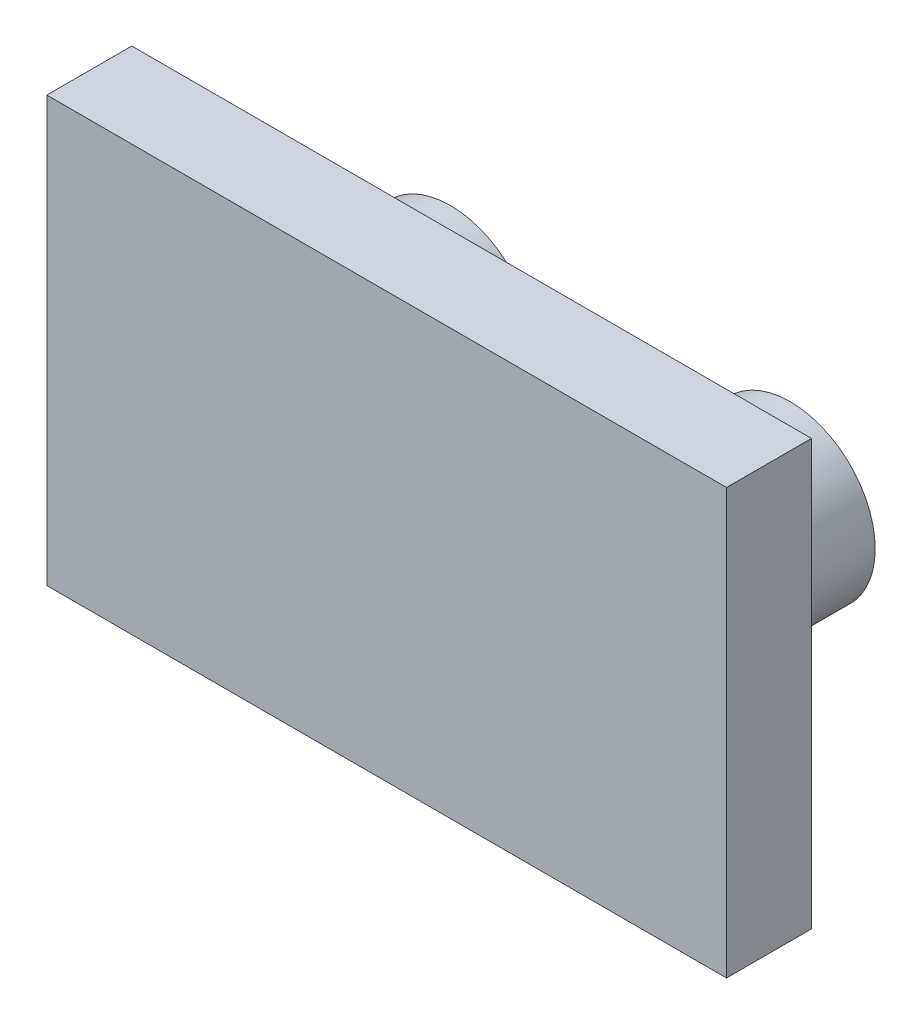
ISO-10303-21;
HEADER;
FILE_DESCRIPTION(('STEP AP214'),'2;1');
FILE_NAME('part.step','',(''),(''),'','','');
FILE_SCHEMA(('AUTOMOTIVE_DESIGN { 1 0 10303 214 1 1 1 1 }'));
ENDSEC;
DATA;
#1=APPLICATION_CONTEXT('core data for automotive mechanical design processes');
#2=APPLICATION_PROTOCOL_DEFINITION('international standard','automotive_design',2000,#1);
#3=PRODUCT_CONTEXT('',#1,'mechanical');
#4=PRODUCT('Part','Part','',(#3));
#5=PRODUCT_RELATED_PRODUCT_CATEGORY('part','',(#4));
#6=PRODUCT_DEFINITION_FORMATION('','',#4);
#7=PRODUCT_DEFINITION_CONTEXT('part definition',#1,'design');
#8=PRODUCT_DEFINITION('design','',#6,#7);
#9=PRODUCT_DEFINITION_SHAPE('','',#8);
#10=(LENGTH_UNIT() NAMED_UNIT(*) SI_UNIT(.MILLI.,.METRE.));
#11=(NAMED_UNIT(*) PLANE_ANGLE_UNIT() SI_UNIT($,.RADIAN.));
#12=(NAMED_UNIT(*) SI_UNIT($,.STERADIAN.) SOLID_ANGLE_UNIT());
#13=UNCERTAINTY_MEASURE_WITH_UNIT(LENGTH_MEASURE(1.E-05),#10,'distance_accuracy_value','');
#14=(GEOMETRIC_REPRESENTATION_CONTEXT(3) GLOBAL_UNCERTAINTY_ASSIGNED_CONTEXT((#13)) GLOBAL_UNIT_ASSIGNED_CONTEXT((#10,
#11,#12)) REPRESENTATION_CONTEXT('',''));
#15=CARTESIAN_POINT('',(0.,0.,0.));
#16=DIRECTION('',(0.,0.,1.));
#17=DIRECTION('',(1.,0.,0.));
#18=AXIS2_PLACEMENT_3D('',#15,#16,#17);
#19=CARTESIAN_POINT('',(-6.20943459252771,100.003007895537,-20.));
#20=DIRECTION('',(1.,0.,0.));
#21=DIRECTION('',(0.,0.,-1.));
#22=AXIS2_PLACEMENT_3D('',#19,#20,#21);
#23=PLANE('',#22);
#24=DIRECTION('',(0.,1.,0.));
#25=VECTOR('',#24,1.);
#26=CARTESIAN_POINT('',(-6.20943459252771,100.003007895537,0.));
#27=LINE('',#26,#25);
#28=CARTESIAN_POINT('',(-6.20943459252771,0.00300789553728253,0.));
#29=VERTEX_POINT('',#28);
#30=CARTESIAN_POINT('',(-6.20943459252771,100.003007895537,0.));
#31=VERTEX_POINT('',#30);
#32=EDGE_CURVE('E107',#29,#31,#27,.T.);
#33=ORIENTED_EDGE('',*,*,#32,.F.);
#34=DIRECTION('',(0.,0.,1.));
#35=VECTOR('',#34,1.);
#36=CARTESIAN_POINT('',(-6.20943459252771,0.00300789553728253,-20.));
#37=LINE('',#36,#35);
#38=CARTESIAN_POINT('',(-6.20943459252771,0.00300789553728253,-20.));
#39=VERTEX_POINT('',#38);
#40=EDGE_CURVE('E55',#39,#29,#37,.T.);
#41=ORIENTED_EDGE('',*,*,#40,.F.);
#42=DIRECTION('',(0.,1.,0.));
#43=VECTOR('',#42,1.);
#44=CARTESIAN_POINT('',(-6.20943459252771,100.003007895537,-20.));
#45=LINE('',#44,#43);
#46=CARTESIAN_POINT('',(-6.20943459252771,100.003007895537,-20.));
#47=VERTEX_POINT('',#46);
#48=EDGE_CURVE('E100',#39,#47,#45,.T.);
#49=ORIENTED_EDGE('',*,*,#48,.T.);
#50=DIRECTION('',(0.,0.,1.));
#51=VECTOR('',#50,1.);
#52=CARTESIAN_POINT('',(-6.20943459252771,100.003007895537,-20.));
#53=LINE('',#52,#51);
#54=EDGE_CURVE('E83',#47,#31,#53,.T.);
#55=ORIENTED_EDGE('',*,*,#54,.T.);
#56=EDGE_LOOP('',(#33,#41,#49,#55));
#57=FACE_BOUND('',#56,.T.);
#58=ADVANCED_FACE('F39',(#57),#23,.T.);
#59=CARTESIAN_POINT('',(-166.209434592528,0.00300789553728253,-20.));
#60=DIRECTION('',(0.,-1.,0.));
#61=DIRECTION('',(0.,0.,-1.));
#62=AXIS2_PLACEMENT_3D('',#59,#60,#61);
#63=PLANE('',#62);
#64=DIRECTION('',(1.,0.,0.));
#65=VECTOR('',#64,1.);
#66=CARTESIAN_POINT('',(-166.209434592528,0.00300789553728253,0.));
#67=LINE('',#66,#65);
#68=CARTESIAN_POINT('',(-166.209434592528,0.00300789553728253,0.));
#69=VERTEX_POINT('',#68);
#70=EDGE_CURVE('E102',#69,#29,#67,.T.);
#71=ORIENTED_EDGE('',*,*,#70,.F.);
#72=DIRECTION('',(0.,0.,1.));
#73=VECTOR('',#72,1.);
#74=CARTESIAN_POINT('',(-166.209434592528,0.00300789553728253,-20.));
#75=LINE('',#74,#73);
#76=CARTESIAN_POINT('',(-166.209434592528,0.00300789553728253,-20.));
#77=VERTEX_POINT('',#76);
#78=EDGE_CURVE('E72',#77,#69,#75,.T.);
#79=ORIENTED_EDGE('',*,*,#78,.F.);
#80=DIRECTION('',(1.,0.,0.));
#81=VECTOR('',#80,1.);
#82=CARTESIAN_POINT('',(-166.209434592528,0.00300789553728253,-20.));
#83=LINE('',#82,#81);
#84=EDGE_CURVE('E97',#77,#39,#83,.T.);
#85=ORIENTED_EDGE('',*,*,#84,.T.);
#86=ORIENTED_EDGE('',*,*,#40,.T.);
#87=EDGE_LOOP('',(#71,#79,#85,#86));
#88=FACE_BOUND('',#87,.T.);
#89=ADVANCED_FACE('F136',(#88),#63,.T.);
#90=CARTESIAN_POINT('',(-166.209434592528,100.003007895537,-20.));
#91=DIRECTION('',(-1.,0.,0.));
#92=DIRECTION('',(0.,0.,1.));
#93=AXIS2_PLACEMENT_3D('',#90,#91,#92);
#94=PLANE('',#93);
#95=DIRECTION('',(0.,-1.,0.));
#96=VECTOR('',#95,1.);
#97=CARTESIAN_POINT('',(-166.209434592528,100.003007895537,0.));
#98=LINE('',#97,#96);
#99=CARTESIAN_POINT('',(-166.209434592528,100.003007895537,0.));
#100=VERTEX_POINT('',#99);
#101=EDGE_CURVE('E91',#100,#69,#98,.T.);
#102=ORIENTED_EDGE('',*,*,#101,.F.);
#103=DIRECTION('',(0.,0.,1.));
#104=VECTOR('',#103,1.);
#105=CARTESIAN_POINT('',(-166.209434592528,100.003007895537,-20.));
#106=LINE('',#105,#104);
#107=CARTESIAN_POINT('',(-166.209434592528,100.003007895537,-20.));
#108=VERTEX_POINT('',#107);
#109=EDGE_CURVE('E86',#108,#100,#106,.T.);
#110=ORIENTED_EDGE('',*,*,#109,.F.);
#111=DIRECTION('',(0.,-1.,0.));
#112=VECTOR('',#111,1.);
#113=CARTESIAN_POINT('',(-166.209434592528,100.003007895537,-20.));
#114=LINE('',#113,#112);
#115=EDGE_CURVE('E89',#108,#77,#114,.T.);
#116=ORIENTED_EDGE('',*,*,#115,.T.);
#117=ORIENTED_EDGE('',*,*,#78,.T.);
#118=EDGE_LOOP('',(#102,#110,#116,#117));
#119=FACE_BOUND('',#118,.T.);
#120=ADVANCED_FACE('F88',(#119),#94,.T.);
#121=CARTESIAN_POINT('',(-166.209434592528,100.003007895537,-20.));
#122=DIRECTION('',(0.,1.,0.));
#123=DIRECTION('',(0.,0.,1.));
#124=AXIS2_PLACEMENT_3D('',#121,#122,#123);
#125=PLANE('',#124);
#126=DIRECTION('',(-1.,0.,0.));
#127=VECTOR('',#126,1.);
#128=CARTESIAN_POINT('',(-166.209434592528,100.003007895537,0.));
#129=LINE('',#128,#127);
#130=EDGE_CURVE('E110',#31,#100,#129,.T.);
#131=ORIENTED_EDGE('',*,*,#130,.F.);
#132=ORIENTED_EDGE('',*,*,#54,.F.);
#133=DIRECTION('',(-1.,0.,0.));
#134=VECTOR('',#133,1.);
#135=CARTESIAN_POINT('',(-166.209434592528,100.003007895537,-20.));
#136=LINE('',#135,#134);
#137=EDGE_CURVE('E96',#47,#108,#136,.T.);
#138=ORIENTED_EDGE('',*,*,#137,.T.);
#139=ORIENTED_EDGE('',*,*,#109,.T.);
#140=EDGE_LOOP('',(#131,#132,#138,#139));
#141=FACE_BOUND('',#140,.T.);
#142=ADVANCED_FACE('F99',(#141),#125,.T.);
#143=CARTESIAN_POINT('',(0.,0.,-20.));
#144=DIRECTION('',(0.,0.,1.));
#145=DIRECTION('',(1.,0.,0.));
#146=AXIS2_PLACEMENT_3D('',#143,#144,#145);
#147=PLANE('',#146);
#148=CARTESIAN_POINT('',(-46.2094345925277,50.0030078955373,-20.));
#149=DIRECTION('',(0.,0.,1.));
#150=DIRECTION('',(1.,0.,0.));
#151=AXIS2_PLACEMENT_3D('',#148,#149,#150);
#152=CIRCLE('',#151,20.);
#153=CARTESIAN_POINT('',(-26.2094345925277,50.0030078955373,-20.));
#154=VERTEX_POINT('',#153);
#155=EDGE_CURVE('E11',#154,#154,#152,.F.);
#156=ORIENTED_EDGE('',*,*,#155,.F.);
#157=EDGE_LOOP('',(#156));
#158=FACE_BOUND('',#157,.T.);
#159=CARTESIAN_POINT('',(-126.209434592528,50.0030078955373,-20.));
#160=DIRECTION('',(0.,0.,1.));
#161=DIRECTION('',(1.,0.,0.));
#162=AXIS2_PLACEMENT_3D('',#159,#160,#161);
#163=CIRCLE('',#162,20.);
#164=CARTESIAN_POINT('',(-106.209434592528,50.0030078955373,-20.));
#165=VERTEX_POINT('',#164);
#166=EDGE_CURVE('E47',#165,#165,#163,.F.);
#167=ORIENTED_EDGE('',*,*,#166,.F.);
#168=EDGE_LOOP('',(#167));
#169=FACE_BOUND('',#168,.T.);
#170=ORIENTED_EDGE('',*,*,#48,.F.);
#171=ORIENTED_EDGE('',*,*,#84,.F.);
#172=ORIENTED_EDGE('',*,*,#115,.F.);
#173=ORIENTED_EDGE('',*,*,#137,.F.);
#174=EDGE_LOOP('',(#170,#171,#172,#173));
#175=FACE_BOUND('',#174,.T.);
#176=ADVANCED_FACE('F95',(#158,#169,#175),#147,.F.);
#177=CARTESIAN_POINT('',(0.,0.,0.));
#178=DIRECTION('',(0.,0.,1.));
#179=DIRECTION('',(1.,0.,0.));
#180=AXIS2_PLACEMENT_3D('',#177,#178,#179);
#181=PLANE('',#180);
#182=ORIENTED_EDGE('',*,*,#32,.T.);
#183=ORIENTED_EDGE('',*,*,#130,.T.);
#184=ORIENTED_EDGE('',*,*,#101,.T.);
#185=ORIENTED_EDGE('',*,*,#70,.T.);
#186=EDGE_LOOP('',(#182,#183,#184,#185));
#187=FACE_BOUND('',#186,.T.);
#188=ADVANCED_FACE('F124',(#187),#181,.T.);
#189=CARTESIAN_POINT('',(-126.209434592528,50.0030078955373,-55.));
#190=DIRECTION('',(0.,0.,1.));
#191=DIRECTION('',(1.,0.,0.));
#192=AXIS2_PLACEMENT_3D('',#189,#190,#191);
#193=CYLINDRICAL_SURFACE('',#192,20.);
#194=CARTESIAN_POINT('',(-126.209434592528,50.0030078955373,-55.));
#195=DIRECTION('',(0.,0.,-1.));
#196=DIRECTION('',(-1.,0.,0.));
#197=AXIS2_PLACEMENT_3D('',#194,#195,#196);
#198=CIRCLE('',#197,20.);
#199=CARTESIAN_POINT('',(-146.209434592528,50.0030078955373,-55.));
#200=VERTEX_POINT('',#199);
#201=EDGE_CURVE('E111',#200,#200,#198,.T.);
#202=ORIENTED_EDGE('',*,*,#201,.F.);
#203=EDGE_LOOP('',(#202));
#204=FACE_BOUND('',#203,.T.);
#205=ORIENTED_EDGE('',*,*,#166,.T.);
#206=EDGE_LOOP('',(#205));
#207=FACE_BOUND('',#206,.T.);
#208=ADVANCED_FACE('F121',(#204,#207),#193,.T.);
#209=CARTESIAN_POINT('',(-126.209434592528,50.0030078955373,-55.));
#210=DIRECTION('',(0.,0.,-1.));
#211=DIRECTION('',(-1.,0.,0.));
#212=AXIS2_PLACEMENT_3D('',#209,#210,#211);
#213=PLANE('',#212);
#214=ORIENTED_EDGE('',*,*,#201,.T.);
#215=EDGE_LOOP('',(#214));
#216=FACE_BOUND('',#215,.T.);
#217=ADVANCED_FACE('F173',(#216),#213,.T.);
#218=CARTESIAN_POINT('',(-46.2094345925277,50.0030078955373,-55.));
#219=DIRECTION('',(0.,0.,1.));
#220=DIRECTION('',(1.,0.,0.));
#221=AXIS2_PLACEMENT_3D('',#218,#219,#220);
#222=CYLINDRICAL_SURFACE('',#221,20.);
#223=CARTESIAN_POINT('',(-46.2094345925277,50.0030078955373,-55.));
#224=DIRECTION('',(0.,0.,-1.));
#225=DIRECTION('',(-1.,0.,0.));
#226=AXIS2_PLACEMENT_3D('',#223,#224,#225);
#227=CIRCLE('',#226,20.);
#228=CARTESIAN_POINT('',(-66.2094345925277,50.0030078955373,-55.));
#229=VERTEX_POINT('',#228);
#230=EDGE_CURVE('E235',#229,#229,#227,.T.);
#231=ORIENTED_EDGE('',*,*,#230,.F.);
#232=EDGE_LOOP('',(#231));
#233=FACE_BOUND('',#232,.T.);
#234=ORIENTED_EDGE('',*,*,#155,.T.);
#235=EDGE_LOOP('',(#234));
#236=FACE_BOUND('',#235,.T.);
#237=ADVANCED_FACE('F183',(#233,#236),#222,.T.);
#238=CARTESIAN_POINT('',(-46.2094345925277,50.0030078955373,-55.));
#239=DIRECTION('',(0.,0.,-1.));
#240=DIRECTION('',(-1.,0.,0.));
#241=AXIS2_PLACEMENT_3D('',#238,#239,#240);
#242=PLANE('',#241);
#243=ORIENTED_EDGE('',*,*,#230,.T.);
#244=EDGE_LOOP('',(#243));
#245=FACE_BOUND('',#244,.T.);
#246=ADVANCED_FACE('F194',(#245),#242,.T.);
#247=CLOSED_SHELL('',(#58,#89,#120,#142,#176,#188,#208,#217,#237,#246));
#248=MANIFOLD_SOLID_BREP('B2',#247);
#249=ADVANCED_BREP_SHAPE_REPRESENTATION('',(#18,#248),#14);
#250=SHAPE_DEFINITION_REPRESENTATION(#9,#249);
ENDSEC;
END-ISO-10303-21;
